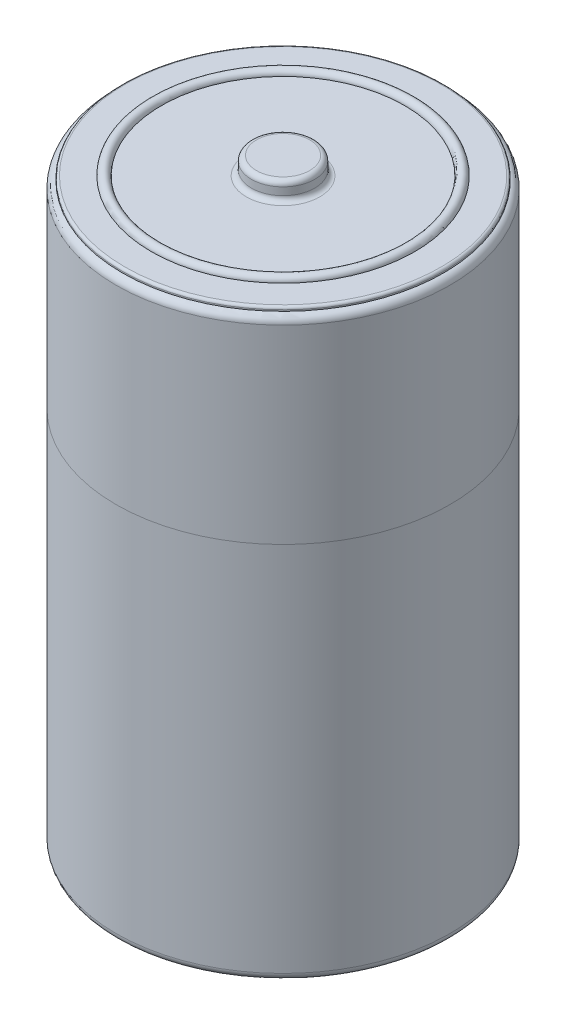
ISO-10303-21;
HEADER;
FILE_DESCRIPTION(('STEP AP214'),'2;1');
FILE_NAME('part.step','',(''),(''),'','','');
FILE_SCHEMA(('AUTOMOTIVE_DESIGN { 1 0 10303 214 1 1 1 1 }'));
ENDSEC;
DATA;
#1=APPLICATION_CONTEXT('core data for automotive mechanical design processes');
#2=APPLICATION_PROTOCOL_DEFINITION('international standard','automotive_design',2000,#1);
#3=PRODUCT_CONTEXT('',#1,'mechanical');
#4=PRODUCT('Part','Part','',(#3));
#5=PRODUCT_RELATED_PRODUCT_CATEGORY('part','',(#4));
#6=PRODUCT_DEFINITION_FORMATION('','',#4);
#7=PRODUCT_DEFINITION_CONTEXT('part definition',#1,'design');
#8=PRODUCT_DEFINITION('design','',#6,#7);
#9=PRODUCT_DEFINITION_SHAPE('','',#8);
#10=(LENGTH_UNIT() NAMED_UNIT(*) SI_UNIT(.MILLI.,.METRE.));
#11=(NAMED_UNIT(*) PLANE_ANGLE_UNIT() SI_UNIT($,.RADIAN.));
#12=(NAMED_UNIT(*) SI_UNIT($,.STERADIAN.) SOLID_ANGLE_UNIT());
#13=UNCERTAINTY_MEASURE_WITH_UNIT(LENGTH_MEASURE(1.E-05),#10,'distance_accuracy_value','');
#14=(GEOMETRIC_REPRESENTATION_CONTEXT(3) GLOBAL_UNCERTAINTY_ASSIGNED_CONTEXT((#13)) GLOBAL_UNIT_ASSIGNED_CONTEXT((#10,
#11,#12)) REPRESENTATION_CONTEXT('',''));
#15=CARTESIAN_POINT('',(0.,0.,0.));
#16=DIRECTION('',(0.,0.,1.));
#17=DIRECTION('',(1.,0.,0.));
#18=AXIS2_PLACEMENT_3D('',#15,#16,#17);
#19=CARTESIAN_POINT('',(0.,0.,0.));
#20=DIRECTION('',(0.,1.,0.));
#21=DIRECTION('',(0.,0.,1.));
#22=AXIS2_PLACEMENT_3D('',#19,#20,#21);
#23=CYLINDRICAL_SURFACE('',#22,16.75);
#24=CARTESIAN_POINT('',(0.,-59.23,0.));
#25=DIRECTION('',(0.,1.,0.));
#26=DIRECTION('',(0.,0.,1.));
#27=AXIS2_PLACEMENT_3D('',#24,#25,#26);
#28=CIRCLE('',#27,16.75);
#29=CARTESIAN_POINT('',(0.,-59.23,16.75));
#30=VERTEX_POINT('',#29);
#31=EDGE_CURVE('E70',#30,#30,#28,.T.);
#32=ORIENTED_EDGE('',*,*,#31,.T.);
#33=EDGE_LOOP('',(#32));
#34=FACE_BOUND('',#33,.T.);
#35=CARTESIAN_POINT('',(0.,-21.971,0.));
#36=DIRECTION('',(0.,1.,0.));
#37=DIRECTION('',(0.,0.,1.));
#38=AXIS2_PLACEMENT_3D('',#35,#36,#37);
#39=CIRCLE('',#38,16.75);
#40=CARTESIAN_POINT('',(0.,-21.971,16.75));
#41=VERTEX_POINT('',#40);
#42=EDGE_CURVE('E10',#41,#41,#39,.T.);
#43=ORIENTED_EDGE('',*,*,#42,.F.);
#44=EDGE_LOOP('',(#43));
#45=FACE_BOUND('',#44,.T.);
#46=ADVANCED_FACE('F35',(#34,#45),#23,.T.);
#47=CARTESIAN_POINT('',(3.81000000000001,-60.246,0.));
#48=DIRECTION('',(0.,1.,0.));
#49=DIRECTION('',(0.,0.,1.));
#50=AXIS2_PLACEMENT_3D('',#47,#48,#49);
#51=PLANE('',#50);
#52=CARTESIAN_POINT('',(0.,-60.246,0.));
#53=DIRECTION('',(0.,1.,0.));
#54=DIRECTION('',(0.,0.,1.));
#55=AXIS2_PLACEMENT_3D('',#52,#53,#54);
#56=CIRCLE('',#55,3.81000000000001);
#57=CARTESIAN_POINT('',(0.,-60.246,3.81000000000001));
#58=VERTEX_POINT('',#57);
#59=EDGE_CURVE('E43',#58,#58,#56,.T.);
#60=ORIENTED_EDGE('',*,*,#59,.F.);
#61=EDGE_LOOP('',(#60));
#62=FACE_BOUND('',#61,.T.);
#63=ADVANCED_FACE('F37',(#62),#51,.F.);
#64=CARTESIAN_POINT('',(0.,-60.5,0.));
#65=DIRECTION('',(0.,1.,0.));
#66=DIRECTION('',(0.,0.,1.));
#67=AXIS2_PLACEMENT_3D('',#64,#65,#66);
#68=TOROIDAL_SURFACE('',#67,3.81000000000001,0.253999999999999);
#69=CARTESIAN_POINT('',(0.,-60.5,0.));
#70=DIRECTION('',(0.,1.,0.));
#71=DIRECTION('',(0.,0.,1.));
#72=AXIS2_PLACEMENT_3D('',#69,#70,#71);
#73=CIRCLE('',#72,4.06400000000001);
#74=CARTESIAN_POINT('',(0.,-60.5,4.06400000000001));
#75=VERTEX_POINT('',#74);
#76=EDGE_CURVE('E49',#75,#75,#73,.T.);
#77=ORIENTED_EDGE('',*,*,#76,.F.);
#78=EDGE_LOOP('',(#77));
#79=FACE_BOUND('',#78,.T.);
#80=ORIENTED_EDGE('',*,*,#59,.T.);
#81=EDGE_LOOP('',(#80));
#82=FACE_BOUND('',#81,.T.);
#83=ADVANCED_FACE('F175',(#79,#82),#68,.F.);
#84=CARTESIAN_POINT('',(11.684,-60.5,0.));
#85=DIRECTION('',(0.,1.,0.));
#86=DIRECTION('',(0.,0.,1.));
#87=AXIS2_PLACEMENT_3D('',#84,#85,#86);
#88=PLANE('',#87);
#89=CARTESIAN_POINT('',(0.,-60.5,0.));
#90=DIRECTION('',(0.,1.,0.));
#91=DIRECTION('',(0.,0.,1.));
#92=AXIS2_PLACEMENT_3D('',#89,#90,#91);
#93=CIRCLE('',#92,11.684);
#94=CARTESIAN_POINT('',(0.,-60.5,11.684));
#95=VERTEX_POINT('',#94);
#96=EDGE_CURVE('E53',#95,#95,#93,.T.);
#97=ORIENTED_EDGE('',*,*,#96,.F.);
#98=EDGE_LOOP('',(#97));
#99=FACE_BOUND('',#98,.T.);
#100=ORIENTED_EDGE('',*,*,#76,.T.);
#101=EDGE_LOOP('',(#100));
#102=FACE_BOUND('',#101,.T.);
#103=ADVANCED_FACE('F202',(#99,#102),#88,.F.);
#104=CARTESIAN_POINT('',(0.,-60.246,0.));
#105=DIRECTION('',(0.,1.,0.));
#106=DIRECTION('',(0.,0.,1.));
#107=AXIS2_PLACEMENT_3D('',#104,#105,#106);
#108=TOROIDAL_SURFACE('',#107,11.684,0.254000000000003);
#109=CARTESIAN_POINT('',(0.,-60.246,0.));
#110=DIRECTION('',(0.,1.,0.));
#111=DIRECTION('',(0.,0.,1.));
#112=AXIS2_PLACEMENT_3D('',#109,#110,#111);
#113=CIRCLE('',#112,11.938);
#114=CARTESIAN_POINT('',(0.,-60.246,11.938));
#115=VERTEX_POINT('',#114);
#116=EDGE_CURVE('E58',#115,#115,#113,.T.);
#117=ORIENTED_EDGE('',*,*,#116,.F.);
#118=EDGE_LOOP('',(#117));
#119=FACE_BOUND('',#118,.T.);
#120=ORIENTED_EDGE('',*,*,#96,.T.);
#121=EDGE_LOOP('',(#120));
#122=FACE_BOUND('',#121,.T.);
#123=ADVANCED_FACE('F196',(#119,#122),#108,.T.);
#124=CARTESIAN_POINT('',(15.100682905,-60.246,0.));
#125=DIRECTION('',(0.,1.,0.));
#126=DIRECTION('',(0.,0.,1.));
#127=AXIS2_PLACEMENT_3D('',#124,#125,#126);
#128=PLANE('',#127);
#129=CARTESIAN_POINT('',(0.,-60.246,0.));
#130=DIRECTION('',(0.,1.,0.));
#131=DIRECTION('',(0.,0.,1.));
#132=AXIS2_PLACEMENT_3D('',#129,#130,#131);
#133=CIRCLE('',#132,15.100682905);
#134=CARTESIAN_POINT('',(0.,-60.246,15.100682905));
#135=VERTEX_POINT('',#134);
#136=EDGE_CURVE('E61',#135,#135,#133,.T.);
#137=ORIENTED_EDGE('',*,*,#136,.F.);
#138=EDGE_LOOP('',(#137));
#139=FACE_BOUND('',#138,.T.);
#140=ORIENTED_EDGE('',*,*,#116,.T.);
#141=EDGE_LOOP('',(#140));
#142=FACE_BOUND('',#141,.T.);
#143=ADVANCED_FACE('F190',(#139,#142),#128,.F.);
#144=CARTESIAN_POINT('',(0.,0.,0.));
#145=DIRECTION('',(0.,1.,0.));
#146=DIRECTION('',(0.,0.,1.));
#147=AXIS2_PLACEMENT_3D('',#144,#145,#146);
#148=CYLINDRICAL_SURFACE('',#147,15.100682905);
#149=CARTESIAN_POINT('',(0.,-59.992,0.));
#150=DIRECTION('',(0.,1.,0.));
#151=DIRECTION('',(0.,0.,1.));
#152=AXIS2_PLACEMENT_3D('',#149,#150,#151);
#153=CIRCLE('',#152,15.100682905);
#154=CARTESIAN_POINT('',(0.,-59.992,15.100682905));
#155=VERTEX_POINT('',#154);
#156=EDGE_CURVE('E64',#155,#155,#153,.T.);
#157=ORIENTED_EDGE('',*,*,#156,.F.);
#158=EDGE_LOOP('',(#157));
#159=FACE_BOUND('',#158,.T.);
#160=ORIENTED_EDGE('',*,*,#136,.T.);
#161=EDGE_LOOP('',(#160));
#162=FACE_BOUND('',#161,.T.);
#163=ADVANCED_FACE('F184',(#159,#162),#148,.T.);
#164=CARTESIAN_POINT('',(15.988,-59.992,0.));
#165=DIRECTION('',(0.,1.,0.));
#166=DIRECTION('',(0.,0.,1.));
#167=AXIS2_PLACEMENT_3D('',#164,#165,#166);
#168=PLANE('',#167);
#169=CARTESIAN_POINT('',(0.,-59.992,0.));
#170=DIRECTION('',(0.,1.,0.));
#171=DIRECTION('',(0.,0.,1.));
#172=AXIS2_PLACEMENT_3D('',#169,#170,#171);
#173=CIRCLE('',#172,15.988);
#174=CARTESIAN_POINT('',(0.,-59.992,15.988));
#175=VERTEX_POINT('',#174);
#176=EDGE_CURVE('E67',#175,#175,#173,.T.);
#177=ORIENTED_EDGE('',*,*,#176,.F.);
#178=EDGE_LOOP('',(#177));
#179=FACE_BOUND('',#178,.T.);
#180=ORIENTED_EDGE('',*,*,#156,.T.);
#181=EDGE_LOOP('',(#180));
#182=FACE_BOUND('',#181,.T.);
#183=ADVANCED_FACE('F167',(#179,#182),#168,.F.);
#184=CARTESIAN_POINT('',(0.,-59.23,0.));
#185=DIRECTION('',(0.,1.,0.));
#186=DIRECTION('',(0.,0.,1.));
#187=AXIS2_PLACEMENT_3D('',#184,#185,#186);
#188=TOROIDAL_SURFACE('',#187,15.988,0.762000000000001);
#189=ORIENTED_EDGE('',*,*,#31,.F.);
#190=EDGE_LOOP('',(#189));
#191=FACE_BOUND('',#190,.T.);
#192=ORIENTED_EDGE('',*,*,#176,.T.);
#193=EDGE_LOOP('',(#192));
#194=FACE_BOUND('',#193,.T.);
#195=ADVANCED_FACE('F162',(#191,#194),#188,.T.);
#196=ORIENTED_EDGE('',*,*,#42,.T.);
#197=EDGE_LOOP('',(#196));
#198=FACE_BOUND('',#197,.T.);
#199=CARTESIAN_POINT('',(0.,-2.921,0.));
#200=DIRECTION('',(0.,1.,0.));
#201=DIRECTION('',(0.,0.,1.));
#202=AXIS2_PLACEMENT_3D('',#199,#200,#201);
#203=CIRCLE('',#202,16.75);
#204=CARTESIAN_POINT('',(0.,-2.921,16.75));
#205=VERTEX_POINT('',#204);
#206=EDGE_CURVE('E73',#205,#205,#203,.T.);
#207=ORIENTED_EDGE('',*,*,#206,.F.);
#208=EDGE_LOOP('',(#207));
#209=FACE_BOUND('',#208,.T.);
#210=ADVANCED_FACE('F157',(#198,#209),#23,.T.);
#211=CARTESIAN_POINT('',(0.,-2.921,0.));
#212=DIRECTION('',(0.,1.,0.));
#213=DIRECTION('',(0.,0.,1.));
#214=AXIS2_PLACEMENT_3D('',#211,#212,#213);
#215=TOROIDAL_SURFACE('',#214,15.988,0.761999999999999);
#216=CARTESIAN_POINT('',(0.,-2.16965786754635,0.));
#217=DIRECTION('',(0.,1.,0.));
#218=DIRECTION('',(0.,0.,1.));
#219=AXIS2_PLACEMENT_3D('',#216,#217,#218);
#220=CIRCLE('',#219,16.115);
#221=CARTESIAN_POINT('',(0.,-2.16965786754635,16.115));
#222=VERTEX_POINT('',#221);
#223=EDGE_CURVE('E76',#222,#222,#220,.T.);
#224=ORIENTED_EDGE('',*,*,#223,.F.);
#225=EDGE_LOOP('',(#224));
#226=FACE_BOUND('',#225,.T.);
#227=ORIENTED_EDGE('',*,*,#206,.T.);
#228=EDGE_LOOP('',(#227));
#229=FACE_BOUND('',#228,.T.);
#230=ADVANCED_FACE('F151',(#226,#229),#215,.T.);
#231=CARTESIAN_POINT('',(0.,0.,0.));
#232=DIRECTION('',(0.,1.,0.));
#233=DIRECTION('',(0.,0.,1.));
#234=AXIS2_PLACEMENT_3D('',#231,#232,#233);
#235=CYLINDRICAL_SURFACE('',#234,16.115);
#236=CARTESIAN_POINT('',(0.,-2.032,0.));
#237=DIRECTION('',(0.,1.,0.));
#238=DIRECTION('',(0.,0.,1.));
#239=AXIS2_PLACEMENT_3D('',#236,#237,#238);
#240=CIRCLE('',#239,16.115);
#241=CARTESIAN_POINT('',(0.,-2.032,16.115));
#242=VERTEX_POINT('',#241);
#243=EDGE_CURVE('E79',#242,#242,#240,.T.);
#244=ORIENTED_EDGE('',*,*,#243,.F.);
#245=EDGE_LOOP('',(#244));
#246=FACE_BOUND('',#245,.T.);
#247=ORIENTED_EDGE('',*,*,#223,.T.);
#248=EDGE_LOOP('',(#247));
#249=FACE_BOUND('',#248,.T.);
#250=ADVANCED_FACE('F145',(#246,#249),#235,.T.);
#251=CARTESIAN_POINT('',(0.,-2.032,0.));
#252=DIRECTION('',(0.,1.,0.));
#253=DIRECTION('',(0.,0.,1.));
#254=AXIS2_PLACEMENT_3D('',#251,#252,#253);
#255=TOROIDAL_SURFACE('',#254,15.861,0.254);
#256=CARTESIAN_POINT('',(0.,-1.778,0.));
#257=DIRECTION('',(0.,1.,0.));
#258=DIRECTION('',(0.,0.,1.));
#259=AXIS2_PLACEMENT_3D('',#256,#257,#258);
#260=CIRCLE('',#259,15.861);
#261=CARTESIAN_POINT('',(0.,-1.778,15.861));
#262=VERTEX_POINT('',#261);
#263=EDGE_CURVE('E82',#262,#262,#260,.T.);
#264=ORIENTED_EDGE('',*,*,#263,.F.);
#265=EDGE_LOOP('',(#264));
#266=FACE_BOUND('',#265,.T.);
#267=ORIENTED_EDGE('',*,*,#243,.T.);
#268=EDGE_LOOP('',(#267));
#269=FACE_BOUND('',#268,.T.);
#270=ADVANCED_FACE('F139',(#266,#269),#255,.T.);
#271=CARTESIAN_POINT('',(13.208,-1.778,0.));
#272=DIRECTION('',(0.,-1.,0.));
#273=DIRECTION('',(0.,0.,-1.));
#274=AXIS2_PLACEMENT_3D('',#271,#272,#273);
#275=PLANE('',#274);
#276=CARTESIAN_POINT('',(0.,-1.778,0.));
#277=DIRECTION('',(0.,1.,0.));
#278=DIRECTION('',(0.,0.,1.));
#279=AXIS2_PLACEMENT_3D('',#276,#277,#278);
#280=CIRCLE('',#279,13.208);
#281=CARTESIAN_POINT('',(0.,-1.778,13.208));
#282=VERTEX_POINT('',#281);
#283=EDGE_CURVE('E85',#282,#282,#280,.T.);
#284=ORIENTED_EDGE('',*,*,#283,.F.);
#285=EDGE_LOOP('',(#284));
#286=FACE_BOUND('',#285,.T.);
#287=ORIENTED_EDGE('',*,*,#263,.T.);
#288=EDGE_LOOP('',(#287));
#289=FACE_BOUND('',#288,.T.);
#290=ADVANCED_FACE('F133',(#286,#289),#275,.F.);
#291=CARTESIAN_POINT('',(0.,-1.778,0.));
#292=DIRECTION('',(0.,1.,0.));
#293=DIRECTION('',(0.,0.,1.));
#294=AXIS2_PLACEMENT_3D('',#291,#292,#293);
#295=TOROIDAL_SURFACE('',#294,12.7,0.508);
#296=CARTESIAN_POINT('',(0.,-1.778,0.));
#297=DIRECTION('',(0.,1.,0.));
#298=DIRECTION('',(0.,0.,1.));
#299=AXIS2_PLACEMENT_3D('',#296,#297,#298);
#300=CIRCLE('',#299,12.192);
#301=CARTESIAN_POINT('',(0.,-1.778,12.192));
#302=VERTEX_POINT('',#301);
#303=EDGE_CURVE('E88',#302,#302,#300,.T.);
#304=ORIENTED_EDGE('',*,*,#303,.F.);
#305=EDGE_LOOP('',(#304));
#306=FACE_BOUND('',#305,.T.);
#307=ORIENTED_EDGE('',*,*,#283,.T.);
#308=EDGE_LOOP('',(#307));
#309=FACE_BOUND('',#308,.T.);
#310=ADVANCED_FACE('F127',(#306,#309),#295,.T.);
#311=CARTESIAN_POINT('',(3.683,-1.778,0.));
#312=DIRECTION('',(0.,-1.,0.));
#313=DIRECTION('',(0.,0.,-1.));
#314=AXIS2_PLACEMENT_3D('',#311,#312,#313);
#315=PLANE('',#314);
#316=CARTESIAN_POINT('',(0.,-1.778,0.));
#317=DIRECTION('',(0.,1.,0.));
#318=DIRECTION('',(0.,0.,1.));
#319=AXIS2_PLACEMENT_3D('',#316,#317,#318);
#320=CIRCLE('',#319,3.683);
#321=CARTESIAN_POINT('',(0.,-1.778,3.683));
#322=VERTEX_POINT('',#321);
#323=EDGE_CURVE('E91',#322,#322,#320,.T.);
#324=ORIENTED_EDGE('',*,*,#323,.F.);
#325=EDGE_LOOP('',(#324));
#326=FACE_BOUND('',#325,.T.);
#327=ORIENTED_EDGE('',*,*,#303,.T.);
#328=EDGE_LOOP('',(#327));
#329=FACE_BOUND('',#328,.T.);
#330=ADVANCED_FACE('F121',(#326,#329),#315,.F.);
#331=CARTESIAN_POINT('',(0.,-1.27,0.));
#332=DIRECTION('',(0.,1.,0.));
#333=DIRECTION('',(0.,0.,1.));
#334=AXIS2_PLACEMENT_3D('',#331,#332,#333);
#335=TOROIDAL_SURFACE('',#334,3.683,0.508);
#336=CARTESIAN_POINT('',(0.,-1.27,0.));
#337=DIRECTION('',(0.,1.,0.));
#338=DIRECTION('',(0.,0.,1.));
#339=AXIS2_PLACEMENT_3D('',#336,#337,#338);
#340=CIRCLE('',#339,3.175);
#341=CARTESIAN_POINT('',(0.,-1.27,3.175));
#342=VERTEX_POINT('',#341);
#343=EDGE_CURVE('E94',#342,#342,#340,.T.);
#344=ORIENTED_EDGE('',*,*,#343,.F.);
#345=EDGE_LOOP('',(#344));
#346=FACE_BOUND('',#345,.T.);
#347=ORIENTED_EDGE('',*,*,#323,.T.);
#348=EDGE_LOOP('',(#347));
#349=FACE_BOUND('',#348,.T.);
#350=ADVANCED_FACE('F115',(#346,#349),#335,.F.);
#351=CARTESIAN_POINT('',(0.,0.,0.));
#352=DIRECTION('',(0.,1.,0.));
#353=DIRECTION('',(0.,0.,1.));
#354=AXIS2_PLACEMENT_3D('',#351,#352,#353);
#355=CYLINDRICAL_SURFACE('',#354,3.175);
#356=CARTESIAN_POINT('',(0.,-0.508000000000004,0.));
#357=DIRECTION('',(0.,1.,0.));
#358=DIRECTION('',(0.,0.,1.));
#359=AXIS2_PLACEMENT_3D('',#356,#357,#358);
#360=CIRCLE('',#359,3.175);
#361=CARTESIAN_POINT('',(0.,-0.508000000000004,3.175));
#362=VERTEX_POINT('',#361);
#363=EDGE_CURVE('E97',#362,#362,#360,.T.);
#364=ORIENTED_EDGE('',*,*,#363,.F.);
#365=EDGE_LOOP('',(#364));
#366=FACE_BOUND('',#365,.T.);
#367=ORIENTED_EDGE('',*,*,#343,.T.);
#368=EDGE_LOOP('',(#367));
#369=FACE_BOUND('',#368,.T.);
#370=ADVANCED_FACE('F109',(#366,#369),#355,.T.);
#371=CARTESIAN_POINT('',(0.,-0.508,0.));
#372=DIRECTION('',(0.,1.,0.));
#373=DIRECTION('',(0.,0.,1.));
#374=AXIS2_PLACEMENT_3D('',#371,#372,#373);
#375=TOROIDAL_SURFACE('',#374,2.667,0.508);
#376=CARTESIAN_POINT('',(0.,0.,0.));
#377=DIRECTION('',(0.,1.,0.));
#378=DIRECTION('',(0.,0.,1.));
#379=AXIS2_PLACEMENT_3D('',#376,#377,#378);
#380=CIRCLE('',#379,2.667);
#381=CARTESIAN_POINT('',(0.,0.,2.667));
#382=VERTEX_POINT('',#381);
#383=EDGE_CURVE('E100',#382,#382,#380,.T.);
#384=ORIENTED_EDGE('',*,*,#383,.F.);
#385=EDGE_LOOP('',(#384));
#386=FACE_BOUND('',#385,.T.);
#387=ORIENTED_EDGE('',*,*,#363,.T.);
#388=EDGE_LOOP('',(#387));
#389=FACE_BOUND('',#388,.T.);
#390=ADVANCED_FACE('F106',(#386,#389),#375,.T.);
#391=CARTESIAN_POINT('',(0.,0.,0.));
#392=DIRECTION('',(0.,-1.,0.));
#393=DIRECTION('',(0.,0.,-1.));
#394=AXIS2_PLACEMENT_3D('',#391,#392,#393);
#395=PLANE('',#394);
#396=ORIENTED_EDGE('',*,*,#383,.T.);
#397=EDGE_LOOP('',(#396));
#398=FACE_BOUND('',#397,.T.);
#399=ADVANCED_FACE('F104',(#398),#395,.F.);
#400=CLOSED_SHELL('',(#46,#63,#83,#103,#123,#143,#163,#183,#195,#210,#230,#250,#270,#290,#310,
#330,#350,#370,#390,#399));
#401=MANIFOLD_SOLID_BREP('B2',#400);
#402=ADVANCED_BREP_SHAPE_REPRESENTATION('',(#18,#401),#14);
#403=SHAPE_DEFINITION_REPRESENTATION(#9,#402);
ENDSEC;
END-ISO-10303-21;
